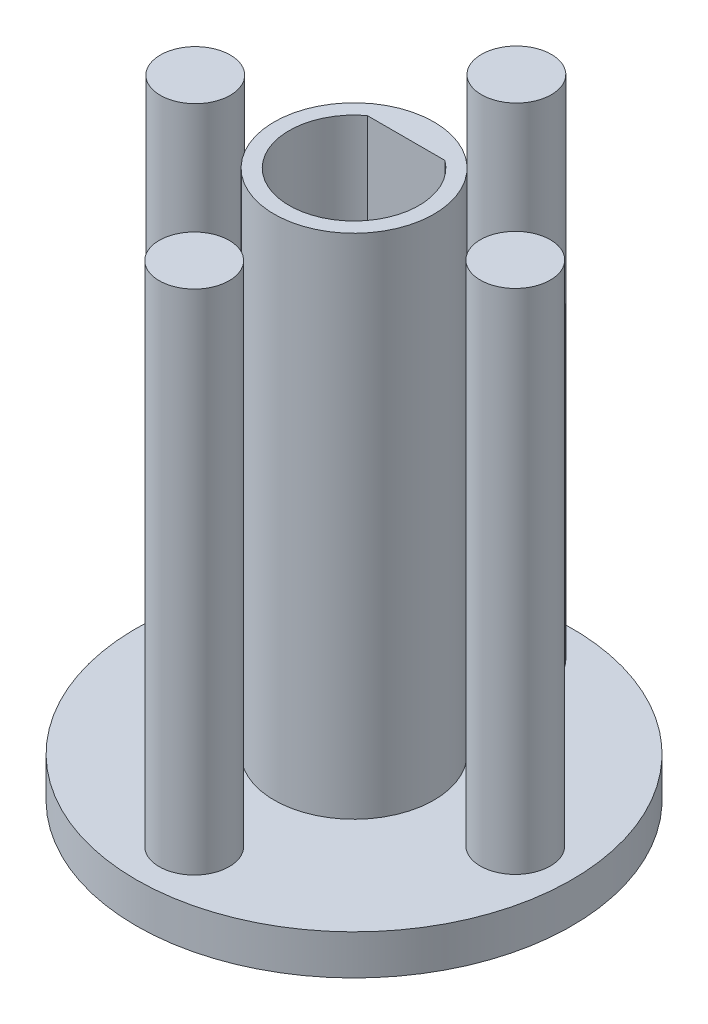
ISO-10303-21;
HEADER;
FILE_DESCRIPTION(('STEP AP214'),'2;1');
FILE_NAME('part.step','',(''),(''),'','','');
FILE_SCHEMA(('AUTOMOTIVE_DESIGN { 1 0 10303 214 1 1 1 1 }'));
ENDSEC;
DATA;
#1=APPLICATION_CONTEXT('core data for automotive mechanical design processes');
#2=APPLICATION_PROTOCOL_DEFINITION('international standard','automotive_design',2000,#1);
#3=PRODUCT_CONTEXT('',#1,'mechanical');
#4=PRODUCT('Part','Part','',(#3));
#5=PRODUCT_RELATED_PRODUCT_CATEGORY('part','',(#4));
#6=PRODUCT_DEFINITION_FORMATION('','',#4);
#7=PRODUCT_DEFINITION_CONTEXT('part definition',#1,'design');
#8=PRODUCT_DEFINITION('design','',#6,#7);
#9=PRODUCT_DEFINITION_SHAPE('','',#8);
#10=(LENGTH_UNIT() NAMED_UNIT(*) SI_UNIT(.MILLI.,.METRE.));
#11=(NAMED_UNIT(*) PLANE_ANGLE_UNIT() SI_UNIT($,.RADIAN.));
#12=(NAMED_UNIT(*) SI_UNIT($,.STERADIAN.) SOLID_ANGLE_UNIT());
#13=UNCERTAINTY_MEASURE_WITH_UNIT(LENGTH_MEASURE(1.E-05),#10,'distance_accuracy_value','');
#14=(GEOMETRIC_REPRESENTATION_CONTEXT(3) GLOBAL_UNCERTAINTY_ASSIGNED_CONTEXT((#13)) GLOBAL_UNIT_ASSIGNED_CONTEXT((#10,
#11,#12)) REPRESENTATION_CONTEXT('',''));
#15=CARTESIAN_POINT('',(0.,0.,0.));
#16=DIRECTION('',(0.,0.,1.));
#17=DIRECTION('',(1.,0.,0.));
#18=AXIS2_PLACEMENT_3D('',#15,#16,#17);
#19=CARTESIAN_POINT('',(0.,2.,0.));
#20=DIRECTION('',(0.,1.,0.));
#21=DIRECTION('',(0.,0.,1.));
#22=AXIS2_PLACEMENT_3D('',#19,#20,#21);
#23=PLANE('',#22);
#24=CARTESIAN_POINT('',(0.,2.,0.));
#25=DIRECTION('',(0.,1.,0.));
#26=DIRECTION('',(0.,0.,1.));
#27=AXIS2_PLACEMENT_3D('',#24,#25,#26);
#28=CIRCLE('',#27,10.9);
#29=CARTESIAN_POINT('',(0.,2.,10.9));
#30=VERTEX_POINT('',#29);
#31=EDGE_CURVE('E110',#30,#30,#28,.T.);
#32=ORIENTED_EDGE('',*,*,#31,.T.);
#33=EDGE_LOOP('',(#32));
#34=FACE_BOUND('',#33,.T.);
#35=CARTESIAN_POINT('',(-7.99946540436632,2.,-0.0531912101153402));
#36=DIRECTION('',(0.,1.,0.));
#37=DIRECTION('',(0.,0.,1.));
#38=AXIS2_PLACEMENT_3D('',#35,#36,#37);
#39=CIRCLE('',#38,1.75);
#40=CARTESIAN_POINT('',(-7.99946540436632,1.99999999999999,-1.80319121011534));
#41=VERTEX_POINT('',#40);
#42=EDGE_CURVE('E46',#41,#41,#39,.T.);
#43=ORIENTED_EDGE('',*,*,#42,.F.);
#44=EDGE_LOOP('',(#43));
#45=FACE_BOUND('',#44,.T.);
#46=CARTESIAN_POINT('',(0.0091799489627781,2.,8.00905715153994));
#47=DIRECTION('',(0.,1.,0.));
#48=DIRECTION('',(0.,0.,1.));
#49=AXIS2_PLACEMENT_3D('',#46,#47,#48);
#50=CIRCLE('',#49,1.75);
#51=CARTESIAN_POINT('',(0.0091799489627781,1.99999999999999,6.25905715153994));
#52=VERTEX_POINT('',#51);
#53=EDGE_CURVE('E106',#52,#52,#50,.F.);
#54=ORIENTED_EDGE('',*,*,#53,.T.);
#55=EDGE_LOOP('',(#54));
#56=FACE_BOUND('',#55,.T.);
#57=CARTESIAN_POINT('',(8.01767982733765,2.,-0.0533357152510716));
#58=DIRECTION('',(0.,1.,0.));
#59=DIRECTION('',(0.,0.,1.));
#60=AXIS2_PLACEMENT_3D('',#57,#58,#59);
#61=CIRCLE('',#60,1.75);
#62=CARTESIAN_POINT('',(8.01767982733765,1.99999999999999,-1.80333571525107));
#63=VERTEX_POINT('',#62);
#64=EDGE_CURVE('E100',#63,#63,#61,.F.);
#65=ORIENTED_EDGE('',*,*,#64,.T.);
#66=EDGE_LOOP('',(#65));
#67=FACE_BOUND('',#66,.T.);
#68=CARTESIAN_POINT('',(0.00903447400855788,2.,-8.11558407690636));
#69=DIRECTION('',(0.,1.,0.));
#70=DIRECTION('',(0.,0.,1.));
#71=AXIS2_PLACEMENT_3D('',#68,#69,#70);
#72=CIRCLE('',#71,1.75000000000001);
#73=CARTESIAN_POINT('',(0.00903447400855788,1.99999999999999,-9.86558407690636));
#74=VERTEX_POINT('',#73);
#75=EDGE_CURVE('E94',#74,#74,#72,.F.);
#76=ORIENTED_EDGE('',*,*,#75,.T.);
#77=EDGE_LOOP('',(#76));
#78=FACE_BOUND('',#77,.T.);
#79=CARTESIAN_POINT('',(0.,2.,0.));
#80=DIRECTION('',(0.,1.,0.));
#81=DIRECTION('',(0.,0.,1.));
#82=AXIS2_PLACEMENT_3D('',#79,#80,#81);
#83=CIRCLE('',#82,4.);
#84=CARTESIAN_POINT('',(0.,1.99999999999999,-4.));
#85=VERTEX_POINT('',#84);
#86=EDGE_CURVE('E88',#85,#85,#83,.F.);
#87=ORIENTED_EDGE('',*,*,#86,.T.);
#88=EDGE_LOOP('',(#87));
#89=FACE_BOUND('',#88,.T.);
#90=ADVANCED_FACE('F42',(#34,#45,#56,#67,#78,#89),#23,.T.);
#91=CARTESIAN_POINT('',(-7.99946540436632,27.4,-0.0531912101153402));
#92=DIRECTION('',(0.,-1.,0.));
#93=DIRECTION('',(0.,0.,-1.));
#94=AXIS2_PLACEMENT_3D('',#91,#92,#93);
#95=CYLINDRICAL_SURFACE('',#94,1.75);
#96=CARTESIAN_POINT('',(-7.99946540436632,27.4,-0.0531912101153402));
#97=DIRECTION('',(0.,1.,0.));
#98=DIRECTION('',(0.,0.,1.));
#99=AXIS2_PLACEMENT_3D('',#96,#97,#98);
#100=CIRCLE('',#99,1.75);
#101=CARTESIAN_POINT('',(-7.99946540436632,27.4,-1.80319121011534));
#102=VERTEX_POINT('',#101);
#103=EDGE_CURVE('E12',#102,#102,#100,.T.);
#104=CARTESIAN_POINT('',(-7.99946540436632,1.99999999999999,-1.80319121011534));
#105=CARTESIAN_POINT('',(-7.99946540436632,2.26458333333333,-1.80319121011534));
#106=CARTESIAN_POINT('',(-7.99946540436632,2.52916666666666,-1.80319121011534));
#107=CARTESIAN_POINT('',(-7.99946540436632,3.05833333333333,-1.80319121011534));
#108=CARTESIAN_POINT('',(-7.99946540436632,3.32291666666666,-1.80319121011534));
#109=CARTESIAN_POINT('',(-7.99946540436632,3.85208333333333,-1.80319121011534));
#110=CARTESIAN_POINT('',(-7.99946540436632,4.11666666666666,-1.80319121011534));
#111=CARTESIAN_POINT('',(-7.99946540436632,4.64583333333333,-1.80319121011534));
#112=CARTESIAN_POINT('',(-7.99946540436632,4.91041666666666,-1.80319121011534));
#113=CARTESIAN_POINT('',(-7.99946540436632,5.43958333333333,-1.80319121011534));
#114=CARTESIAN_POINT('',(-7.99946540436632,5.70416666666666,-1.80319121011534));
#115=CARTESIAN_POINT('',(-7.99946540436632,6.23333333333333,-1.80319121011534));
#116=CARTESIAN_POINT('',(-7.99946540436632,6.49791666666666,-1.80319121011534));
#117=CARTESIAN_POINT('',(-7.99946540436632,7.02708333333333,-1.80319121011534));
#118=CARTESIAN_POINT('',(-7.99946540436632,7.29166666666666,-1.80319121011534));
#119=CARTESIAN_POINT('',(-7.99946540436632,7.82083333333333,-1.80319121011534));
#120=CARTESIAN_POINT('',(-7.99946540436632,8.08541666666666,-1.80319121011534));
#121=CARTESIAN_POINT('',(-7.99946540436632,8.61458333333333,-1.80319121011534));
#122=CARTESIAN_POINT('',(-7.99946540436632,8.87916666666666,-1.80319121011534));
#123=CARTESIAN_POINT('',(-7.99946540436632,9.40833333333333,-1.80319121011534));
#124=CARTESIAN_POINT('',(-7.99946540436632,9.67291666666666,-1.80319121011534));
#125=CARTESIAN_POINT('',(-7.99946540436632,10.2020833333333,-1.80319121011534));
#126=CARTESIAN_POINT('',(-7.99946540436632,10.4666666666667,-1.80319121011534));
#127=CARTESIAN_POINT('',(-7.99946540436632,10.9958333333333,-1.80319121011534));
#128=CARTESIAN_POINT('',(-7.99946540436632,11.2604166666667,-1.80319121011534));
#129=CARTESIAN_POINT('',(-7.99946540436632,11.7895833333333,-1.80319121011534));
#130=CARTESIAN_POINT('',(-7.99946540436632,12.0541666666667,-1.80319121011534));
#131=CARTESIAN_POINT('',(-7.99946540436632,12.5833333333333,-1.80319121011534));
#132=CARTESIAN_POINT('',(-7.99946540436632,12.8479166666667,-1.80319121011534));
#133=CARTESIAN_POINT('',(-7.99946540436632,13.3770833333333,-1.80319121011534));
#134=CARTESIAN_POINT('',(-7.99946540436632,13.6416666666667,-1.80319121011534));
#135=CARTESIAN_POINT('',(-7.99946540436632,14.1708333333333,-1.80319121011534));
#136=CARTESIAN_POINT('',(-7.99946540436632,14.4354166666667,-1.80319121011534));
#137=CARTESIAN_POINT('',(-7.99946540436632,14.9645833333333,-1.80319121011534));
#138=CARTESIAN_POINT('',(-7.99946540436632,15.2291666666667,-1.80319121011534));
#139=CARTESIAN_POINT('',(-7.99946540436632,15.7583333333333,-1.80319121011534));
#140=CARTESIAN_POINT('',(-7.99946540436632,16.0229166666667,-1.80319121011534));
#141=CARTESIAN_POINT('',(-7.99946540436632,16.5520833333333,-1.80319121011534));
#142=CARTESIAN_POINT('',(-7.99946540436632,16.8166666666667,-1.80319121011534));
#143=CARTESIAN_POINT('',(-7.99946540436632,17.3458333333333,-1.80319121011534));
#144=CARTESIAN_POINT('',(-7.99946540436632,17.6104166666667,-1.80319121011534));
#145=CARTESIAN_POINT('',(-7.99946540436632,18.1395833333333,-1.80319121011534));
#146=CARTESIAN_POINT('',(-7.99946540436632,18.4041666666667,-1.80319121011534));
#147=CARTESIAN_POINT('',(-7.99946540436632,18.9333333333333,-1.80319121011534));
#148=CARTESIAN_POINT('',(-7.99946540436632,19.1979166666667,-1.80319121011534));
#149=CARTESIAN_POINT('',(-7.99946540436632,19.7270833333333,-1.80319121011534));
#150=CARTESIAN_POINT('',(-7.99946540436632,19.9916666666667,-1.80319121011534));
#151=CARTESIAN_POINT('',(-7.99946540436632,20.5208333333333,-1.80319121011534));
#152=CARTESIAN_POINT('',(-7.99946540436632,20.7854166666667,-1.80319121011534));
#153=CARTESIAN_POINT('',(-7.99946540436632,21.3145833333333,-1.80319121011534));
#154=CARTESIAN_POINT('',(-7.99946540436632,21.5791666666667,-1.80319121011534));
#155=CARTESIAN_POINT('',(-7.99946540436632,22.1083333333333,-1.80319121011534));
#156=CARTESIAN_POINT('',(-7.99946540436632,22.3729166666667,-1.80319121011534));
#157=CARTESIAN_POINT('',(-7.99946540436632,22.9020833333333,-1.80319121011534));
#158=CARTESIAN_POINT('',(-7.99946540436632,23.1666666666667,-1.80319121011534));
#159=CARTESIAN_POINT('',(-7.99946540436632,23.6958333333333,-1.80319121011534));
#160=CARTESIAN_POINT('',(-7.99946540436632,23.9604166666667,-1.80319121011534));
#161=CARTESIAN_POINT('',(-7.99946540436632,24.4895833333333,-1.80319121011534));
#162=CARTESIAN_POINT('',(-7.99946540436632,24.7541666666667,-1.80319121011534));
#163=CARTESIAN_POINT('',(-7.99946540436632,25.2833333333333,-1.80319121011534));
#164=CARTESIAN_POINT('',(-7.99946540436632,25.5479166666667,-1.80319121011534));
#165=CARTESIAN_POINT('',(-7.99946540436632,26.0770833333333,-1.80319121011534));
#166=CARTESIAN_POINT('',(-7.99946540436632,26.3416666666667,-1.80319121011534));
#167=CARTESIAN_POINT('',(-7.99946540436632,26.8708333333333,-1.80319121011534));
#168=CARTESIAN_POINT('',(-7.99946540436632,27.1354166666667,-1.80319121011534));
#169=CARTESIAN_POINT('',(-7.99946540436632,27.4,-1.80319121011534));
#170=B_SPLINE_CURVE_WITH_KNOTS('',3,(#104,#105,#106,#107,#108,#109,#110,#111,#112,#113,#114,
#115,#116,#117,#118,#119,#120,#121,#122,#123,#124,#125,#126,#127,#128,#129,#130,#131,#132,#133,
#134,#135,#136,#137,#138,#139,#140,#141,#142,#143,#144,#145,#146,#147,#148,#149,#150,#151,#152,
#153,#154,#155,#156,#157,#158,#159,#160,#161,#162,#163,#164,#165,#166,#167,#168,#169),
.UNSPECIFIED.,.F.,.F.,(4,2,2,2,2,2,2,2,2,2,2,2,2,2,2,2,2,2,2,2,2,2,2,2,2,2,2,2,2,2,2,2,4),(0.,
0.793749999999999,1.5875,2.38125,3.175,3.96875,4.7625,5.55625,6.35,7.14375,7.9375,8.73125,9.525,
10.31875,11.1125,11.90625,12.7,13.49375,14.2875,15.08125,15.875,16.66875,17.4625,18.25625,19.05,
19.84375,20.6375,21.43125,22.225,23.01875,23.8125,24.60625,25.4),.UNSPECIFIED.);
#171=EDGE_CURVE('BSEAM44',#41,#102,#170,.T.);
#172=ORIENTED_EDGE('',*,*,#42,.T.);
#173=ORIENTED_EDGE('',*,*,#103,.F.);
#174=ORIENTED_EDGE('',*,*,#171,.T.);
#175=ORIENTED_EDGE('',*,*,#171,.F.);
#176=EDGE_LOOP('',(#172,#174,#173,#175));
#177=FACE_BOUND('',#176,.T.);
#178=ADVANCED_FACE('F44',(#177),#95,.T.);
#179=CARTESIAN_POINT('',(-7.99946540436632,27.4,-0.0531912101153402));
#180=DIRECTION('',(0.,1.,0.));
#181=DIRECTION('',(0.,0.,1.));
#182=AXIS2_PLACEMENT_3D('',#179,#180,#181);
#183=PLANE('',#182);
#184=ORIENTED_EDGE('',*,*,#103,.T.);
#185=EDGE_LOOP('',(#184));
#186=FACE_BOUND('',#185,.T.);
#187=ADVANCED_FACE('F128',(#186),#183,.T.);
#188=CARTESIAN_POINT('',(0.,2.,0.));
#189=DIRECTION('',(0.,-1.,0.));
#190=DIRECTION('',(0.,0.,-1.));
#191=AXIS2_PLACEMENT_3D('',#188,#189,#190);
#192=CYLINDRICAL_SURFACE('',#191,10.9);
#193=ORIENTED_EDGE('',*,*,#31,.F.);
#194=EDGE_LOOP('',(#193));
#195=FACE_BOUND('',#194,.T.);
#196=CARTESIAN_POINT('',(0.,0.,0.));
#197=DIRECTION('',(0.,1.,0.));
#198=DIRECTION('',(0.,0.,1.));
#199=AXIS2_PLACEMENT_3D('',#196,#197,#198);
#200=CIRCLE('',#199,10.9);
#201=CARTESIAN_POINT('',(0.,0.,10.9));
#202=VERTEX_POINT('',#201);
#203=EDGE_CURVE('E109',#202,#202,#200,.T.);
#204=ORIENTED_EDGE('',*,*,#203,.T.);
#205=EDGE_LOOP('',(#204));
#206=FACE_BOUND('',#205,.T.);
#207=ADVANCED_FACE('F116',(#195,#206),#192,.T.);
#208=CARTESIAN_POINT('',(-7.99946540436632,0.,-0.0531912101153402));
#209=DIRECTION('',(0.,1.,0.));
#210=DIRECTION('',(0.,0.,1.));
#211=AXIS2_PLACEMENT_3D('',#208,#209,#210);
#212=PLANE('',#211);
#213=ORIENTED_EDGE('',*,*,#203,.F.);
#214=EDGE_LOOP('',(#213));
#215=FACE_BOUND('',#214,.T.);
#216=ADVANCED_FACE('F118',(#215),#212,.F.);
#217=CARTESIAN_POINT('',(0.0091799489627781,27.4,8.00905715153994));
#218=DIRECTION('',(0.,-1.,0.));
#219=DIRECTION('',(0.,0.,-1.));
#220=AXIS2_PLACEMENT_3D('',#217,#218,#219);
#221=CYLINDRICAL_SURFACE('',#220,1.75);
#222=CARTESIAN_POINT('',(0.0091799489627781,27.4,8.00905715153994));
#223=DIRECTION('',(0.,1.,0.));
#224=DIRECTION('',(0.,0.,1.));
#225=AXIS2_PLACEMENT_3D('',#222,#223,#224);
#226=CIRCLE('',#225,1.75);
#227=CARTESIAN_POINT('',(0.0091799489627781,27.4,6.25905715153994));
#228=VERTEX_POINT('',#227);
#229=EDGE_CURVE('E103',#228,#228,#226,.T.);
#230=CARTESIAN_POINT('',(0.0091799489627781,1.99999999999999,6.25905715153994));
#231=CARTESIAN_POINT('',(0.0091799489627781,2.26458333333333,6.25905715153994));
#232=CARTESIAN_POINT('',(0.0091799489627781,2.52916666666666,6.25905715153994));
#233=CARTESIAN_POINT('',(0.0091799489627781,3.05833333333333,6.25905715153994));
#234=CARTESIAN_POINT('',(0.0091799489627781,3.32291666666666,6.25905715153994));
#235=CARTESIAN_POINT('',(0.0091799489627781,3.85208333333333,6.25905715153994));
#236=CARTESIAN_POINT('',(0.0091799489627781,4.11666666666666,6.25905715153994));
#237=CARTESIAN_POINT('',(0.0091799489627781,4.64583333333333,6.25905715153994));
#238=CARTESIAN_POINT('',(0.0091799489627781,4.91041666666666,6.25905715153994));
#239=CARTESIAN_POINT('',(0.0091799489627781,5.43958333333333,6.25905715153994));
#240=CARTESIAN_POINT('',(0.0091799489627781,5.70416666666666,6.25905715153994));
#241=CARTESIAN_POINT('',(0.0091799489627781,6.23333333333333,6.25905715153994));
#242=CARTESIAN_POINT('',(0.0091799489627781,6.49791666666666,6.25905715153994));
#243=CARTESIAN_POINT('',(0.0091799489627781,7.02708333333333,6.25905715153994));
#244=CARTESIAN_POINT('',(0.0091799489627781,7.29166666666666,6.25905715153994));
#245=CARTESIAN_POINT('',(0.0091799489627781,7.82083333333333,6.25905715153994));
#246=CARTESIAN_POINT('',(0.0091799489627781,8.08541666666666,6.25905715153994));
#247=CARTESIAN_POINT('',(0.0091799489627781,8.61458333333333,6.25905715153994));
#248=CARTESIAN_POINT('',(0.0091799489627781,8.87916666666666,6.25905715153994));
#249=CARTESIAN_POINT('',(0.0091799489627781,9.40833333333333,6.25905715153994));
#250=CARTESIAN_POINT('',(0.0091799489627781,9.67291666666666,6.25905715153994));
#251=CARTESIAN_POINT('',(0.0091799489627781,10.2020833333333,6.25905715153994));
#252=CARTESIAN_POINT('',(0.0091799489627781,10.4666666666667,6.25905715153994));
#253=CARTESIAN_POINT('',(0.0091799489627781,10.9958333333333,6.25905715153994));
#254=CARTESIAN_POINT('',(0.0091799489627781,11.2604166666667,6.25905715153994));
#255=CARTESIAN_POINT('',(0.0091799489627781,11.7895833333333,6.25905715153994));
#256=CARTESIAN_POINT('',(0.0091799489627781,12.0541666666667,6.25905715153994));
#257=CARTESIAN_POINT('',(0.0091799489627781,12.5833333333333,6.25905715153994));
#258=CARTESIAN_POINT('',(0.0091799489627781,12.8479166666667,6.25905715153994));
#259=CARTESIAN_POINT('',(0.0091799489627781,13.3770833333333,6.25905715153994));
#260=CARTESIAN_POINT('',(0.0091799489627781,13.6416666666667,6.25905715153994));
#261=CARTESIAN_POINT('',(0.0091799489627781,14.1708333333333,6.25905715153994));
#262=CARTESIAN_POINT('',(0.0091799489627781,14.4354166666667,6.25905715153994));
#263=CARTESIAN_POINT('',(0.0091799489627781,14.9645833333333,6.25905715153994));
#264=CARTESIAN_POINT('',(0.0091799489627781,15.2291666666667,6.25905715153994));
#265=CARTESIAN_POINT('',(0.0091799489627781,15.7583333333333,6.25905715153994));
#266=CARTESIAN_POINT('',(0.0091799489627781,16.0229166666667,6.25905715153994));
#267=CARTESIAN_POINT('',(0.0091799489627781,16.5520833333333,6.25905715153994));
#268=CARTESIAN_POINT('',(0.0091799489627781,16.8166666666667,6.25905715153994));
#269=CARTESIAN_POINT('',(0.0091799489627781,17.3458333333333,6.25905715153994));
#270=CARTESIAN_POINT('',(0.0091799489627781,17.6104166666667,6.25905715153994));
#271=CARTESIAN_POINT('',(0.0091799489627781,18.1395833333333,6.25905715153994));
#272=CARTESIAN_POINT('',(0.0091799489627781,18.4041666666667,6.25905715153994));
#273=CARTESIAN_POINT('',(0.0091799489627781,18.9333333333333,6.25905715153994));
#274=CARTESIAN_POINT('',(0.0091799489627781,19.1979166666667,6.25905715153994));
#275=CARTESIAN_POINT('',(0.0091799489627781,19.7270833333333,6.25905715153994));
#276=CARTESIAN_POINT('',(0.0091799489627781,19.9916666666667,6.25905715153994));
#277=CARTESIAN_POINT('',(0.0091799489627781,20.5208333333333,6.25905715153994));
#278=CARTESIAN_POINT('',(0.0091799489627781,20.7854166666667,6.25905715153994));
#279=CARTESIAN_POINT('',(0.0091799489627781,21.3145833333333,6.25905715153994));
#280=CARTESIAN_POINT('',(0.0091799489627781,21.5791666666667,6.25905715153994));
#281=CARTESIAN_POINT('',(0.0091799489627781,22.1083333333333,6.25905715153994));
#282=CARTESIAN_POINT('',(0.0091799489627781,22.3729166666667,6.25905715153994));
#283=CARTESIAN_POINT('',(0.0091799489627781,22.9020833333333,6.25905715153994));
#284=CARTESIAN_POINT('',(0.0091799489627781,23.1666666666667,6.25905715153994));
#285=CARTESIAN_POINT('',(0.0091799489627781,23.6958333333333,6.25905715153994));
#286=CARTESIAN_POINT('',(0.0091799489627781,23.9604166666667,6.25905715153994));
#287=CARTESIAN_POINT('',(0.0091799489627781,24.4895833333333,6.25905715153994));
#288=CARTESIAN_POINT('',(0.0091799489627781,24.7541666666667,6.25905715153994));
#289=CARTESIAN_POINT('',(0.0091799489627781,25.2833333333333,6.25905715153994));
#290=CARTESIAN_POINT('',(0.0091799489627781,25.5479166666667,6.25905715153994));
#291=CARTESIAN_POINT('',(0.0091799489627781,26.0770833333333,6.25905715153994));
#292=CARTESIAN_POINT('',(0.0091799489627781,26.3416666666667,6.25905715153994));
#293=CARTESIAN_POINT('',(0.0091799489627781,26.8708333333333,6.25905715153994));
#294=CARTESIAN_POINT('',(0.0091799489627781,27.1354166666667,6.25905715153994));
#295=CARTESIAN_POINT('',(0.0091799489627781,27.4,6.25905715153994));
#296=B_SPLINE_CURVE_WITH_KNOTS('',3,(#230,#231,#232,#233,#234,#235,#236,#237,#238,#239,#240,
#241,#242,#243,#244,#245,#246,#247,#248,#249,#250,#251,#252,#253,#254,#255,#256,#257,#258,#259,
#260,#261,#262,#263,#264,#265,#266,#267,#268,#269,#270,#271,#272,#273,#274,#275,#276,#277,#278,
#279,#280,#281,#282,#283,#284,#285,#286,#287,#288,#289,#290,#291,#292,#293,#294,#295),
.UNSPECIFIED.,.F.,.F.,(4,2,2,2,2,2,2,2,2,2,2,2,2,2,2,2,2,2,2,2,2,2,2,2,2,2,2,2,2,2,2,2,4),(0.,
0.793749999999999,1.5875,2.38125,3.175,3.96875,4.7625,5.55625,6.35,7.14375,7.9375,8.73125,9.525,
10.31875,11.1125,11.90625,12.7,13.49375,14.2875,15.08125,15.875,16.66875,17.4625,18.25625,19.05,
19.84375,20.6375,21.43125,22.225,23.01875,23.8125,24.60625,25.4),.UNSPECIFIED.);
#297=EDGE_CURVE('BSEAM120',#52,#228,#296,.T.);
#298=ORIENTED_EDGE('',*,*,#53,.F.);
#299=ORIENTED_EDGE('',*,*,#229,.F.);
#300=ORIENTED_EDGE('',*,*,#297,.T.);
#301=ORIENTED_EDGE('',*,*,#297,.F.);
#302=EDGE_LOOP('',(#298,#300,#299,#301));
#303=FACE_BOUND('',#302,.T.);
#304=ADVANCED_FACE('F120',(#303),#221,.T.);
#305=CARTESIAN_POINT('',(0.0091799489627781,27.4,8.00905715153994));
#306=DIRECTION('',(0.,1.,0.));
#307=DIRECTION('',(0.,0.,1.));
#308=AXIS2_PLACEMENT_3D('',#305,#306,#307);
#309=PLANE('',#308);
#310=ORIENTED_EDGE('',*,*,#229,.T.);
#311=EDGE_LOOP('',(#310));
#312=FACE_BOUND('',#311,.T.);
#313=ADVANCED_FACE('F125',(#312),#309,.T.);
#314=CARTESIAN_POINT('',(8.01767982733765,27.4,-0.0533357152510716));
#315=DIRECTION('',(0.,-1.,0.));
#316=DIRECTION('',(0.,0.,-1.));
#317=AXIS2_PLACEMENT_3D('',#314,#315,#316);
#318=CYLINDRICAL_SURFACE('',#317,1.75);
#319=CARTESIAN_POINT('',(8.01767982733765,27.4,-0.0533357152510716));
#320=DIRECTION('',(0.,1.,0.));
#321=DIRECTION('',(0.,0.,1.));
#322=AXIS2_PLACEMENT_3D('',#319,#320,#321);
#323=CIRCLE('',#322,1.75);
#324=CARTESIAN_POINT('',(8.01767982733765,27.4,-1.80333571525107));
#325=VERTEX_POINT('',#324);
#326=EDGE_CURVE('E97',#325,#325,#323,.T.);
#327=CARTESIAN_POINT('',(8.01767982733765,1.99999999999999,-1.80333571525107));
#328=CARTESIAN_POINT('',(8.01767982733765,2.26458333333333,-1.80333571525107));
#329=CARTESIAN_POINT('',(8.01767982733765,2.52916666666666,-1.80333571525107));
#330=CARTESIAN_POINT('',(8.01767982733765,3.05833333333333,-1.80333571525107));
#331=CARTESIAN_POINT('',(8.01767982733765,3.32291666666666,-1.80333571525107));
#332=CARTESIAN_POINT('',(8.01767982733765,3.85208333333333,-1.80333571525107));
#333=CARTESIAN_POINT('',(8.01767982733765,4.11666666666666,-1.80333571525107));
#334=CARTESIAN_POINT('',(8.01767982733765,4.64583333333333,-1.80333571525107));
#335=CARTESIAN_POINT('',(8.01767982733765,4.91041666666666,-1.80333571525107));
#336=CARTESIAN_POINT('',(8.01767982733765,5.43958333333333,-1.80333571525107));
#337=CARTESIAN_POINT('',(8.01767982733765,5.70416666666666,-1.80333571525107));
#338=CARTESIAN_POINT('',(8.01767982733765,6.23333333333333,-1.80333571525107));
#339=CARTESIAN_POINT('',(8.01767982733765,6.49791666666666,-1.80333571525107));
#340=CARTESIAN_POINT('',(8.01767982733765,7.02708333333333,-1.80333571525107));
#341=CARTESIAN_POINT('',(8.01767982733765,7.29166666666666,-1.80333571525107));
#342=CARTESIAN_POINT('',(8.01767982733765,7.82083333333333,-1.80333571525107));
#343=CARTESIAN_POINT('',(8.01767982733765,8.08541666666666,-1.80333571525107));
#344=CARTESIAN_POINT('',(8.01767982733765,8.61458333333333,-1.80333571525107));
#345=CARTESIAN_POINT('',(8.01767982733765,8.87916666666666,-1.80333571525107));
#346=CARTESIAN_POINT('',(8.01767982733765,9.40833333333333,-1.80333571525107));
#347=CARTESIAN_POINT('',(8.01767982733765,9.67291666666666,-1.80333571525107));
#348=CARTESIAN_POINT('',(8.01767982733765,10.2020833333333,-1.80333571525107));
#349=CARTESIAN_POINT('',(8.01767982733765,10.4666666666667,-1.80333571525107));
#350=CARTESIAN_POINT('',(8.01767982733765,10.9958333333333,-1.80333571525107));
#351=CARTESIAN_POINT('',(8.01767982733765,11.2604166666667,-1.80333571525107));
#352=CARTESIAN_POINT('',(8.01767982733765,11.7895833333333,-1.80333571525107));
#353=CARTESIAN_POINT('',(8.01767982733765,12.0541666666667,-1.80333571525107));
#354=CARTESIAN_POINT('',(8.01767982733765,12.5833333333333,-1.80333571525107));
#355=CARTESIAN_POINT('',(8.01767982733765,12.8479166666667,-1.80333571525107));
#356=CARTESIAN_POINT('',(8.01767982733765,13.3770833333333,-1.80333571525107));
#357=CARTESIAN_POINT('',(8.01767982733765,13.6416666666667,-1.80333571525107));
#358=CARTESIAN_POINT('',(8.01767982733765,14.1708333333333,-1.80333571525107));
#359=CARTESIAN_POINT('',(8.01767982733765,14.4354166666667,-1.80333571525107));
#360=CARTESIAN_POINT('',(8.01767982733765,14.9645833333333,-1.80333571525107));
#361=CARTESIAN_POINT('',(8.01767982733765,15.2291666666667,-1.80333571525107));
#362=CARTESIAN_POINT('',(8.01767982733765,15.7583333333333,-1.80333571525107));
#363=CARTESIAN_POINT('',(8.01767982733765,16.0229166666667,-1.80333571525107));
#364=CARTESIAN_POINT('',(8.01767982733765,16.5520833333333,-1.80333571525107));
#365=CARTESIAN_POINT('',(8.01767982733765,16.8166666666667,-1.80333571525107));
#366=CARTESIAN_POINT('',(8.01767982733765,17.3458333333333,-1.80333571525107));
#367=CARTESIAN_POINT('',(8.01767982733765,17.6104166666667,-1.80333571525107));
#368=CARTESIAN_POINT('',(8.01767982733765,18.1395833333333,-1.80333571525107));
#369=CARTESIAN_POINT('',(8.01767982733765,18.4041666666667,-1.80333571525107));
#370=CARTESIAN_POINT('',(8.01767982733765,18.9333333333333,-1.80333571525107));
#371=CARTESIAN_POINT('',(8.01767982733765,19.1979166666667,-1.80333571525107));
#372=CARTESIAN_POINT('',(8.01767982733765,19.7270833333333,-1.80333571525107));
#373=CARTESIAN_POINT('',(8.01767982733765,19.9916666666667,-1.80333571525107));
#374=CARTESIAN_POINT('',(8.01767982733765,20.5208333333333,-1.80333571525107));
#375=CARTESIAN_POINT('',(8.01767982733765,20.7854166666667,-1.80333571525107));
#376=CARTESIAN_POINT('',(8.01767982733765,21.3145833333333,-1.80333571525107));
#377=CARTESIAN_POINT('',(8.01767982733765,21.5791666666667,-1.80333571525107));
#378=CARTESIAN_POINT('',(8.01767982733765,22.1083333333333,-1.80333571525107));
#379=CARTESIAN_POINT('',(8.01767982733765,22.3729166666667,-1.80333571525107));
#380=CARTESIAN_POINT('',(8.01767982733765,22.9020833333333,-1.80333571525107));
#381=CARTESIAN_POINT('',(8.01767982733765,23.1666666666667,-1.80333571525107));
#382=CARTESIAN_POINT('',(8.01767982733765,23.6958333333333,-1.80333571525107));
#383=CARTESIAN_POINT('',(8.01767982733765,23.9604166666667,-1.80333571525107));
#384=CARTESIAN_POINT('',(8.01767982733765,24.4895833333333,-1.80333571525107));
#385=CARTESIAN_POINT('',(8.01767982733765,24.7541666666667,-1.80333571525107));
#386=CARTESIAN_POINT('',(8.01767982733765,25.2833333333333,-1.80333571525107));
#387=CARTESIAN_POINT('',(8.01767982733765,25.5479166666667,-1.80333571525107));
#388=CARTESIAN_POINT('',(8.01767982733765,26.0770833333333,-1.80333571525107));
#389=CARTESIAN_POINT('',(8.01767982733765,26.3416666666667,-1.80333571525107));
#390=CARTESIAN_POINT('',(8.01767982733765,26.8708333333333,-1.80333571525107));
#391=CARTESIAN_POINT('',(8.01767982733765,27.1354166666667,-1.80333571525107));
#392=CARTESIAN_POINT('',(8.01767982733765,27.4,-1.80333571525107));
#393=B_SPLINE_CURVE_WITH_KNOTS('',3,(#327,#328,#329,#330,#331,#332,#333,#334,#335,#336,#337,
#338,#339,#340,#341,#342,#343,#344,#345,#346,#347,#348,#349,#350,#351,#352,#353,#354,#355,#356,
#357,#358,#359,#360,#361,#362,#363,#364,#365,#366,#367,#368,#369,#370,#371,#372,#373,#374,#375,
#376,#377,#378,#379,#380,#381,#382,#383,#384,#385,#386,#387,#388,#389,#390,#391,#392),
.UNSPECIFIED.,.F.,.F.,(4,2,2,2,2,2,2,2,2,2,2,2,2,2,2,2,2,2,2,2,2,2,2,2,2,2,2,2,2,2,2,2,4),(0.,
0.793749999999999,1.5875,2.38125,3.175,3.96875,4.7625,5.55625,6.35,7.14375,7.9375,8.73125,9.525,
10.31875,11.1125,11.90625,12.7,13.49375,14.2875,15.08125,15.875,16.66875,17.4625,18.25625,19.05,
19.84375,20.6375,21.43125,22.225,23.01875,23.8125,24.60625,25.4),.UNSPECIFIED.);
#394=EDGE_CURVE('BSEAM164',#63,#325,#393,.T.);
#395=ORIENTED_EDGE('',*,*,#64,.F.);
#396=ORIENTED_EDGE('',*,*,#326,.F.);
#397=ORIENTED_EDGE('',*,*,#394,.T.);
#398=ORIENTED_EDGE('',*,*,#394,.F.);
#399=EDGE_LOOP('',(#395,#397,#396,#398));
#400=FACE_BOUND('',#399,.T.);
#401=ADVANCED_FACE('F164',(#400),#318,.T.);
#402=CARTESIAN_POINT('',(8.01767982733765,27.4,-0.0533357152510716));
#403=DIRECTION('',(0.,1.,0.));
#404=DIRECTION('',(0.,0.,1.));
#405=AXIS2_PLACEMENT_3D('',#402,#403,#404);
#406=PLANE('',#405);
#407=ORIENTED_EDGE('',*,*,#326,.T.);
#408=EDGE_LOOP('',(#407));
#409=FACE_BOUND('',#408,.T.);
#410=ADVANCED_FACE('F159',(#409),#406,.T.);
#411=CARTESIAN_POINT('',(0.00903447400855788,27.4,-8.11558407690636));
#412=DIRECTION('',(0.,-1.,0.));
#413=DIRECTION('',(0.,0.,-1.));
#414=AXIS2_PLACEMENT_3D('',#411,#412,#413);
#415=CYLINDRICAL_SURFACE('',#414,1.75000000000001);
#416=CARTESIAN_POINT('',(0.00903447400855788,27.4,-8.11558407690636));
#417=DIRECTION('',(0.,1.,0.));
#418=DIRECTION('',(0.,0.,1.));
#419=AXIS2_PLACEMENT_3D('',#416,#417,#418);
#420=CIRCLE('',#419,1.75000000000001);
#421=CARTESIAN_POINT('',(0.00903447400855788,27.4,-9.86558407690636));
#422=VERTEX_POINT('',#421);
#423=EDGE_CURVE('E91',#422,#422,#420,.T.);
#424=CARTESIAN_POINT('',(0.00903447400855788,1.99999999999999,-9.86558407690636));
#425=CARTESIAN_POINT('',(0.00903447400855788,2.26458333333333,-9.86558407690636));
#426=CARTESIAN_POINT('',(0.00903447400855788,2.52916666666666,-9.86558407690636));
#427=CARTESIAN_POINT('',(0.00903447400855788,3.05833333333333,-9.86558407690636));
#428=CARTESIAN_POINT('',(0.00903447400855788,3.32291666666666,-9.86558407690636));
#429=CARTESIAN_POINT('',(0.00903447400855788,3.85208333333333,-9.86558407690636));
#430=CARTESIAN_POINT('',(0.00903447400855788,4.11666666666666,-9.86558407690636));
#431=CARTESIAN_POINT('',(0.00903447400855788,4.64583333333333,-9.86558407690636));
#432=CARTESIAN_POINT('',(0.00903447400855788,4.91041666666666,-9.86558407690636));
#433=CARTESIAN_POINT('',(0.00903447400855788,5.43958333333333,-9.86558407690636));
#434=CARTESIAN_POINT('',(0.00903447400855788,5.70416666666666,-9.86558407690636));
#435=CARTESIAN_POINT('',(0.00903447400855788,6.23333333333333,-9.86558407690636));
#436=CARTESIAN_POINT('',(0.00903447400855788,6.49791666666666,-9.86558407690636));
#437=CARTESIAN_POINT('',(0.00903447400855788,7.02708333333333,-9.86558407690636));
#438=CARTESIAN_POINT('',(0.00903447400855788,7.29166666666666,-9.86558407690636));
#439=CARTESIAN_POINT('',(0.00903447400855788,7.82083333333333,-9.86558407690636));
#440=CARTESIAN_POINT('',(0.00903447400855788,8.08541666666666,-9.86558407690636));
#441=CARTESIAN_POINT('',(0.00903447400855788,8.61458333333333,-9.86558407690636));
#442=CARTESIAN_POINT('',(0.00903447400855788,8.87916666666666,-9.86558407690636));
#443=CARTESIAN_POINT('',(0.00903447400855788,9.40833333333333,-9.86558407690636));
#444=CARTESIAN_POINT('',(0.00903447400855788,9.67291666666666,-9.86558407690636));
#445=CARTESIAN_POINT('',(0.00903447400855788,10.2020833333333,-9.86558407690636));
#446=CARTESIAN_POINT('',(0.00903447400855788,10.4666666666667,-9.86558407690636));
#447=CARTESIAN_POINT('',(0.00903447400855788,10.9958333333333,-9.86558407690636));
#448=CARTESIAN_POINT('',(0.00903447400855788,11.2604166666667,-9.86558407690636));
#449=CARTESIAN_POINT('',(0.00903447400855788,11.7895833333333,-9.86558407690636));
#450=CARTESIAN_POINT('',(0.00903447400855788,12.0541666666667,-9.86558407690636));
#451=CARTESIAN_POINT('',(0.00903447400855788,12.5833333333333,-9.86558407690636));
#452=CARTESIAN_POINT('',(0.00903447400855788,12.8479166666667,-9.86558407690636));
#453=CARTESIAN_POINT('',(0.00903447400855788,13.3770833333333,-9.86558407690636));
#454=CARTESIAN_POINT('',(0.00903447400855788,13.6416666666667,-9.86558407690636));
#455=CARTESIAN_POINT('',(0.00903447400855788,14.1708333333333,-9.86558407690636));
#456=CARTESIAN_POINT('',(0.00903447400855788,14.4354166666667,-9.86558407690636));
#457=CARTESIAN_POINT('',(0.00903447400855788,14.9645833333333,-9.86558407690636));
#458=CARTESIAN_POINT('',(0.00903447400855788,15.2291666666667,-9.86558407690636));
#459=CARTESIAN_POINT('',(0.00903447400855788,15.7583333333333,-9.86558407690636));
#460=CARTESIAN_POINT('',(0.00903447400855788,16.0229166666667,-9.86558407690636));
#461=CARTESIAN_POINT('',(0.00903447400855788,16.5520833333333,-9.86558407690636));
#462=CARTESIAN_POINT('',(0.00903447400855788,16.8166666666667,-9.86558407690636));
#463=CARTESIAN_POINT('',(0.00903447400855788,17.3458333333333,-9.86558407690636));
#464=CARTESIAN_POINT('',(0.00903447400855788,17.6104166666667,-9.86558407690636));
#465=CARTESIAN_POINT('',(0.00903447400855788,18.1395833333333,-9.86558407690636));
#466=CARTESIAN_POINT('',(0.00903447400855788,18.4041666666667,-9.86558407690636));
#467=CARTESIAN_POINT('',(0.00903447400855788,18.9333333333333,-9.86558407690636));
#468=CARTESIAN_POINT('',(0.00903447400855788,19.1979166666667,-9.86558407690636));
#469=CARTESIAN_POINT('',(0.00903447400855788,19.7270833333333,-9.86558407690636));
#470=CARTESIAN_POINT('',(0.00903447400855788,19.9916666666667,-9.86558407690636));
#471=CARTESIAN_POINT('',(0.00903447400855788,20.5208333333333,-9.86558407690636));
#472=CARTESIAN_POINT('',(0.00903447400855788,20.7854166666667,-9.86558407690636));
#473=CARTESIAN_POINT('',(0.00903447400855788,21.3145833333333,-9.86558407690636));
#474=CARTESIAN_POINT('',(0.00903447400855788,21.5791666666667,-9.86558407690636));
#475=CARTESIAN_POINT('',(0.00903447400855788,22.1083333333333,-9.86558407690636));
#476=CARTESIAN_POINT('',(0.00903447400855788,22.3729166666667,-9.86558407690636));
#477=CARTESIAN_POINT('',(0.00903447400855788,22.9020833333333,-9.86558407690636));
#478=CARTESIAN_POINT('',(0.00903447400855788,23.1666666666667,-9.86558407690636));
#479=CARTESIAN_POINT('',(0.00903447400855788,23.6958333333333,-9.86558407690636));
#480=CARTESIAN_POINT('',(0.00903447400855788,23.9604166666667,-9.86558407690636));
#481=CARTESIAN_POINT('',(0.00903447400855788,24.4895833333333,-9.86558407690636));
#482=CARTESIAN_POINT('',(0.00903447400855788,24.7541666666667,-9.86558407690636));
#483=CARTESIAN_POINT('',(0.00903447400855788,25.2833333333333,-9.86558407690636));
#484=CARTESIAN_POINT('',(0.00903447400855788,25.5479166666667,-9.86558407690636));
#485=CARTESIAN_POINT('',(0.00903447400855788,26.0770833333333,-9.86558407690636));
#486=CARTESIAN_POINT('',(0.00903447400855788,26.3416666666667,-9.86558407690636));
#487=CARTESIAN_POINT('',(0.00903447400855788,26.8708333333333,-9.86558407690636));
#488=CARTESIAN_POINT('',(0.00903447400855788,27.1354166666667,-9.86558407690636));
#489=CARTESIAN_POINT('',(0.00903447400855788,27.4,-9.86558407690636));
#490=B_SPLINE_CURVE_WITH_KNOTS('',3,(#424,#425,#426,#427,#428,#429,#430,#431,#432,#433,#434,
#435,#436,#437,#438,#439,#440,#441,#442,#443,#444,#445,#446,#447,#448,#449,#450,#451,#452,#453,
#454,#455,#456,#457,#458,#459,#460,#461,#462,#463,#464,#465,#466,#467,#468,#469,#470,#471,#472,
#473,#474,#475,#476,#477,#478,#479,#480,#481,#482,#483,#484,#485,#486,#487,#488,#489),
.UNSPECIFIED.,.F.,.F.,(4,2,2,2,2,2,2,2,2,2,2,2,2,2,2,2,2,2,2,2,2,2,2,2,2,2,2,2,2,2,2,2,4),(0.,
0.793749999999999,1.5875,2.38125,3.175,3.96875,4.7625,5.55625,6.35,7.14375,7.9375,8.73125,9.525,
10.31875,11.1125,11.90625,12.7,13.49375,14.2875,15.08125,15.875,16.66875,17.4625,18.25625,19.05,
19.84375,20.6375,21.43125,22.225,23.01875,23.8125,24.60625,25.4),.UNSPECIFIED.);
#491=EDGE_CURVE('BSEAM155',#74,#422,#490,.T.);
#492=ORIENTED_EDGE('',*,*,#75,.F.);
#493=ORIENTED_EDGE('',*,*,#423,.F.);
#494=ORIENTED_EDGE('',*,*,#491,.T.);
#495=ORIENTED_EDGE('',*,*,#491,.F.);
#496=EDGE_LOOP('',(#492,#494,#493,#495));
#497=FACE_BOUND('',#496,.T.);
#498=ADVANCED_FACE('F155',(#497),#415,.T.);
#499=CARTESIAN_POINT('',(0.00903447400855788,27.4,-8.11558407690636));
#500=DIRECTION('',(0.,1.,0.));
#501=DIRECTION('',(0.,0.,1.));
#502=AXIS2_PLACEMENT_3D('',#499,#500,#501);
#503=PLANE('',#502);
#504=ORIENTED_EDGE('',*,*,#423,.T.);
#505=EDGE_LOOP('',(#504));
#506=FACE_BOUND('',#505,.T.);
#507=ADVANCED_FACE('F158',(#506),#503,.T.);
#508=CARTESIAN_POINT('',(0.,27.4,0.));
#509=DIRECTION('',(0.,1.,0.));
#510=DIRECTION('',(0.,0.,1.));
#511=AXIS2_PLACEMENT_3D('',#508,#509,#510);
#512=PLANE('',#511);
#513=CARTESIAN_POINT('',(0.,27.4,0.));
#514=DIRECTION('',(0.,1.,0.));
#515=DIRECTION('',(0.,0.,1.));
#516=AXIS2_PLACEMENT_3D('',#513,#514,#515);
#517=CIRCLE('',#516,4.);
#518=CARTESIAN_POINT('',(0.,27.4,-4.));
#519=VERTEX_POINT('',#518);
#520=EDGE_CURVE('E75',#519,#519,#517,.T.);
#521=ORIENTED_EDGE('',*,*,#520,.T.);
#522=EDGE_LOOP('',(#521));
#523=FACE_BOUND('',#522,.T.);
#524=DIRECTION('',(1.,0.,0.));
#525=VECTOR('',#524,1.);
#526=CARTESIAN_POINT('',(-1.94264577563397,27.4,-2.60549945123991));
#527=LINE('',#526,#525);
#528=CARTESIAN_POINT('',(-1.94264577563397,27.4,-2.60549945123991));
#529=VERTEX_POINT('',#528);
#530=CARTESIAN_POINT('',(1.94264577563397,27.4,-2.60549945123991));
#531=VERTEX_POINT('',#530);
#532=EDGE_CURVE('E71',#529,#531,#527,.T.);
#533=ORIENTED_EDGE('',*,*,#532,.T.);
#534=CARTESIAN_POINT('',(0.,27.4,0.));
#535=DIRECTION('',(0.,1.,0.));
#536=DIRECTION('',(0.,0.,1.));
#537=AXIS2_PLACEMENT_3D('',#534,#535,#536);
#538=CIRCLE('',#537,3.25);
#539=EDGE_CURVE('E77',#529,#531,#538,.T.);
#540=ORIENTED_EDGE('',*,*,#539,.F.);
#541=EDGE_LOOP('',(#533,#540));
#542=FACE_BOUND('',#541,.T.);
#543=ADVANCED_FACE('F81',(#523,#542),#512,.T.);
#544=CARTESIAN_POINT('',(0.,27.4,0.));
#545=DIRECTION('',(0.,-1.,0.));
#546=DIRECTION('',(0.,0.,-1.));
#547=AXIS2_PLACEMENT_3D('',#544,#545,#546);
#548=CYLINDRICAL_SURFACE('',#547,4.);
#549=CARTESIAN_POINT('',(0.,1.99999999999999,-4.));
#550=CARTESIAN_POINT('',(0.,2.26458333333333,-4.));
#551=CARTESIAN_POINT('',(0.,2.52916666666666,-4.));
#552=CARTESIAN_POINT('',(0.,3.05833333333333,-4.));
#553=CARTESIAN_POINT('',(0.,3.32291666666666,-4.));
#554=CARTESIAN_POINT('',(0.,3.85208333333333,-4.));
#555=CARTESIAN_POINT('',(0.,4.11666666666666,-4.));
#556=CARTESIAN_POINT('',(0.,4.64583333333333,-4.));
#557=CARTESIAN_POINT('',(0.,4.91041666666666,-4.));
#558=CARTESIAN_POINT('',(0.,5.43958333333333,-4.));
#559=CARTESIAN_POINT('',(0.,5.70416666666666,-4.));
#560=CARTESIAN_POINT('',(0.,6.23333333333333,-4.));
#561=CARTESIAN_POINT('',(0.,6.49791666666666,-4.));
#562=CARTESIAN_POINT('',(0.,7.02708333333333,-4.));
#563=CARTESIAN_POINT('',(0.,7.29166666666666,-4.));
#564=CARTESIAN_POINT('',(0.,7.82083333333333,-4.));
#565=CARTESIAN_POINT('',(0.,8.08541666666666,-4.));
#566=CARTESIAN_POINT('',(0.,8.61458333333333,-4.));
#567=CARTESIAN_POINT('',(0.,8.87916666666666,-4.));
#568=CARTESIAN_POINT('',(0.,9.40833333333333,-4.));
#569=CARTESIAN_POINT('',(0.,9.67291666666666,-4.));
#570=CARTESIAN_POINT('',(0.,10.2020833333333,-4.));
#571=CARTESIAN_POINT('',(0.,10.4666666666667,-4.));
#572=CARTESIAN_POINT('',(0.,10.9958333333333,-4.));
#573=CARTESIAN_POINT('',(0.,11.2604166666667,-4.));
#574=CARTESIAN_POINT('',(0.,11.7895833333333,-4.));
#575=CARTESIAN_POINT('',(0.,12.0541666666667,-4.));
#576=CARTESIAN_POINT('',(0.,12.5833333333333,-4.));
#577=CARTESIAN_POINT('',(0.,12.8479166666667,-4.));
#578=CARTESIAN_POINT('',(0.,13.3770833333333,-4.));
#579=CARTESIAN_POINT('',(0.,13.6416666666667,-4.));
#580=CARTESIAN_POINT('',(0.,14.1708333333333,-4.));
#581=CARTESIAN_POINT('',(0.,14.4354166666667,-4.));
#582=CARTESIAN_POINT('',(0.,14.9645833333333,-4.));
#583=CARTESIAN_POINT('',(0.,15.2291666666667,-4.));
#584=CARTESIAN_POINT('',(0.,15.7583333333333,-4.));
#585=CARTESIAN_POINT('',(0.,16.0229166666667,-4.));
#586=CARTESIAN_POINT('',(0.,16.5520833333333,-4.));
#587=CARTESIAN_POINT('',(0.,16.8166666666667,-4.));
#588=CARTESIAN_POINT('',(0.,17.3458333333333,-4.));
#589=CARTESIAN_POINT('',(0.,17.6104166666667,-4.));
#590=CARTESIAN_POINT('',(0.,18.1395833333333,-4.));
#591=CARTESIAN_POINT('',(0.,18.4041666666667,-4.));
#592=CARTESIAN_POINT('',(0.,18.9333333333333,-4.));
#593=CARTESIAN_POINT('',(0.,19.1979166666667,-4.));
#594=CARTESIAN_POINT('',(0.,19.7270833333333,-4.));
#595=CARTESIAN_POINT('',(0.,19.9916666666667,-4.));
#596=CARTESIAN_POINT('',(0.,20.5208333333333,-4.));
#597=CARTESIAN_POINT('',(0.,20.7854166666667,-4.));
#598=CARTESIAN_POINT('',(0.,21.3145833333333,-4.));
#599=CARTESIAN_POINT('',(0.,21.5791666666667,-4.));
#600=CARTESIAN_POINT('',(0.,22.1083333333333,-4.));
#601=CARTESIAN_POINT('',(0.,22.3729166666667,-4.));
#602=CARTESIAN_POINT('',(0.,22.9020833333333,-4.));
#603=CARTESIAN_POINT('',(0.,23.1666666666667,-4.));
#604=CARTESIAN_POINT('',(0.,23.6958333333333,-4.));
#605=CARTESIAN_POINT('',(0.,23.9604166666667,-4.));
#606=CARTESIAN_POINT('',(0.,24.4895833333333,-4.));
#607=CARTESIAN_POINT('',(0.,24.7541666666667,-4.));
#608=CARTESIAN_POINT('',(0.,25.2833333333333,-4.));
#609=CARTESIAN_POINT('',(0.,25.5479166666667,-4.));
#610=CARTESIAN_POINT('',(0.,26.0770833333333,-4.));
#611=CARTESIAN_POINT('',(0.,26.3416666666667,-4.));
#612=CARTESIAN_POINT('',(0.,26.8708333333333,-4.));
#613=CARTESIAN_POINT('',(0.,27.1354166666667,-4.));
#614=CARTESIAN_POINT('',(0.,27.4,-4.));
#615=B_SPLINE_CURVE_WITH_KNOTS('',3,(#549,#550,#551,#552,#553,#554,#555,#556,#557,#558,#559,
#560,#561,#562,#563,#564,#565,#566,#567,#568,#569,#570,#571,#572,#573,#574,#575,#576,#577,#578,
#579,#580,#581,#582,#583,#584,#585,#586,#587,#588,#589,#590,#591,#592,#593,#594,#595,#596,#597,
#598,#599,#600,#601,#602,#603,#604,#605,#606,#607,#608,#609,#610,#611,#612,#613,#614),
.UNSPECIFIED.,.F.,.F.,(4,2,2,2,2,2,2,2,2,2,2,2,2,2,2,2,2,2,2,2,2,2,2,2,2,2,2,2,2,2,2,2,4),(0.,
0.793749999999999,1.5875,2.38125,3.175,3.96875,4.7625,5.55625,6.35,7.14375,7.9375,8.73125,9.525,
10.31875,11.1125,11.90625,12.7,13.49375,14.2875,15.08125,15.875,16.66875,17.4625,18.25625,19.05,
19.84375,20.6375,21.43125,22.225,23.01875,23.8125,24.60625,25.4),.UNSPECIFIED.);
#616=EDGE_CURVE('BSEAM151',#85,#519,#615,.T.);
#617=ORIENTED_EDGE('',*,*,#86,.F.);
#618=ORIENTED_EDGE('',*,*,#520,.F.);
#619=ORIENTED_EDGE('',*,*,#616,.T.);
#620=ORIENTED_EDGE('',*,*,#616,.F.);
#621=EDGE_LOOP('',(#617,#619,#618,#620));
#622=FACE_BOUND('',#621,.T.);
#623=ADVANCED_FACE('F151',(#622),#548,.T.);
#624=CARTESIAN_POINT('',(0.,27.4,0.));
#625=DIRECTION('',(0.,-1.,0.));
#626=DIRECTION('',(0.,0.,-1.));
#627=AXIS2_PLACEMENT_3D('',#624,#625,#626);
#628=CYLINDRICAL_SURFACE('',#627,3.25);
#629=DIRECTION('',(0.,-1.,0.));
#630=VECTOR('',#629,1.);
#631=CARTESIAN_POINT('',(1.94264577563397,27.4,-2.60549945123991));
#632=LINE('',#631,#630);
#633=CARTESIAN_POINT('',(1.94264577563397,2.00000000000001,-2.60549945123991));
#634=VERTEX_POINT('',#633);
#635=EDGE_CURVE('E67',#531,#634,#632,.T.);
#636=ORIENTED_EDGE('',*,*,#635,.T.);
#637=CARTESIAN_POINT('',(0.,2.,0.));
#638=DIRECTION('',(0.,1.,0.));
#639=DIRECTION('',(0.,0.,1.));
#640=AXIS2_PLACEMENT_3D('',#637,#638,#639);
#641=CIRCLE('',#640,3.25);
#642=CARTESIAN_POINT('',(-1.94264577563397,2.,-2.60549945123991));
#643=VERTEX_POINT('',#642);
#644=EDGE_CURVE('E86',#634,#643,#641,.F.);
#645=ORIENTED_EDGE('',*,*,#644,.T.);
#646=DIRECTION('',(0.,-1.,0.));
#647=VECTOR('',#646,1.);
#648=CARTESIAN_POINT('',(-1.94264577563397,27.4,-2.60549945123991));
#649=LINE('',#648,#647);
#650=EDGE_CURVE('E57',#529,#643,#649,.T.);
#651=ORIENTED_EDGE('',*,*,#650,.F.);
#652=ORIENTED_EDGE('',*,*,#539,.T.);
#653=EDGE_LOOP('',(#636,#645,#651,#652));
#654=FACE_BOUND('',#653,.T.);
#655=ADVANCED_FACE('F78',(#654),#628,.F.);
#656=CARTESIAN_POINT('',(-1.94264577563397,27.4,-2.60549945123991));
#657=DIRECTION('',(0.,0.,-1.));
#658=DIRECTION('',(-1.,0.,0.));
#659=AXIS2_PLACEMENT_3D('',#656,#657,#658);
#660=PLANE('',#659);
#661=DIRECTION('',(-1.,0.,0.));
#662=VECTOR('',#661,1.);
#663=CARTESIAN_POINT('',(0.,2.,-2.60549945123991));
#664=LINE('',#663,#662);
#665=EDGE_CURVE('E62',#634,#643,#664,.T.);
#666=ORIENTED_EDGE('',*,*,#665,.F.);
#667=ORIENTED_EDGE('',*,*,#635,.F.);
#668=ORIENTED_EDGE('',*,*,#532,.F.);
#669=ORIENTED_EDGE('',*,*,#650,.T.);
#670=EDGE_LOOP('',(#666,#667,#668,#669));
#671=FACE_BOUND('',#670,.T.);
#672=ADVANCED_FACE('F69',(#671),#660,.F.);
#673=ORIENTED_EDGE('',*,*,#644,.F.);
#674=ORIENTED_EDGE('',*,*,#665,.T.);
#675=EDGE_LOOP('',(#673,#674));
#676=FACE_BOUND('',#675,.T.);
#677=ADVANCED_FACE('F135',(#676),#23,.T.);
#678=CLOSED_SHELL('',(#90,#178,#187,#207,#216,#304,#313,#401,#410,#498,#507,#543,#623,#655,#672,#677));
#679=MANIFOLD_SOLID_BREP('B2',#678);
#680=ADVANCED_BREP_SHAPE_REPRESENTATION('',(#18,#679),#14);
#681=SHAPE_DEFINITION_REPRESENTATION(#9,#680);
ENDSEC;
END-ISO-10303-21;
